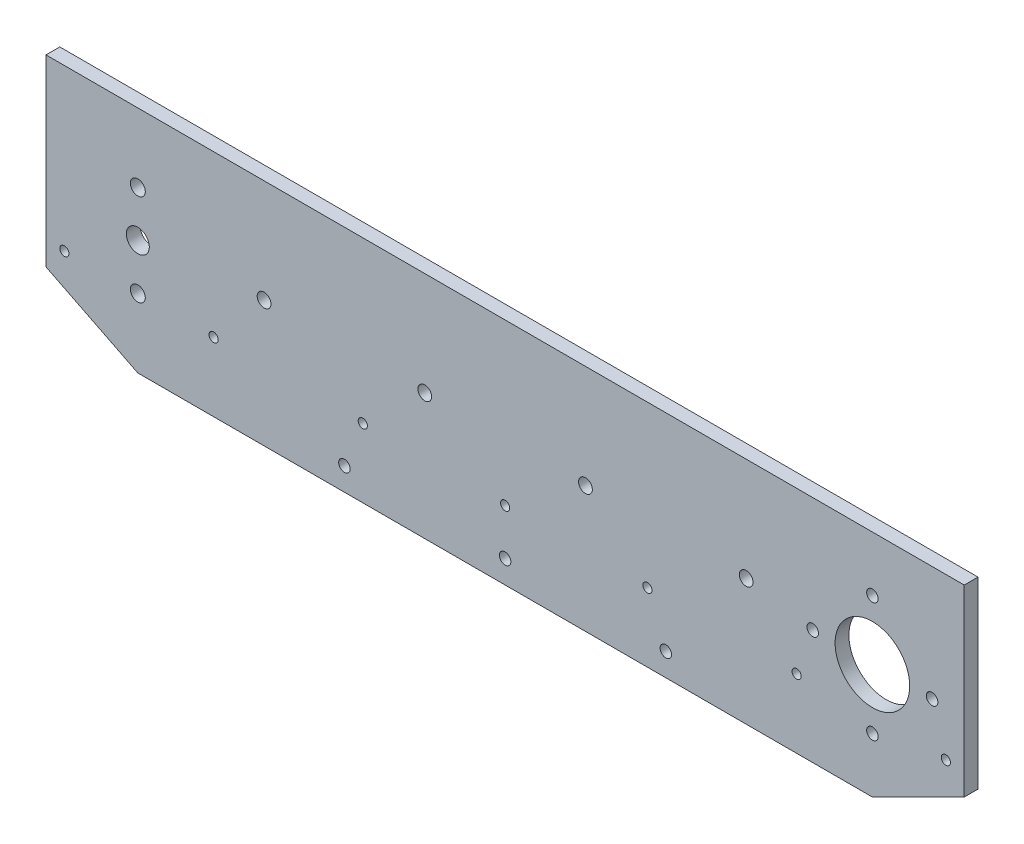
ISO-10303-21;
HEADER;
FILE_DESCRIPTION(('STEP AP214'),'2;1');
FILE_NAME('part.step','',(''),(''),'','','');
FILE_SCHEMA(('AUTOMOTIVE_DESIGN { 1 0 10303 214 1 1 1 1 }'));
ENDSEC;
DATA;
#1=APPLICATION_CONTEXT('core data for automotive mechanical design processes');
#2=APPLICATION_PROTOCOL_DEFINITION('international standard','automotive_design',2000,#1);
#3=PRODUCT_CONTEXT('',#1,'mechanical');
#4=PRODUCT('Part','Part','',(#3));
#5=PRODUCT_RELATED_PRODUCT_CATEGORY('part','',(#4));
#6=PRODUCT_DEFINITION_FORMATION('','',#4);
#7=PRODUCT_DEFINITION_CONTEXT('part definition',#1,'design');
#8=PRODUCT_DEFINITION('design','',#6,#7);
#9=PRODUCT_DEFINITION_SHAPE('','',#8);
#10=(LENGTH_UNIT() NAMED_UNIT(*) SI_UNIT(.MILLI.,.METRE.));
#11=(NAMED_UNIT(*) PLANE_ANGLE_UNIT() SI_UNIT($,.RADIAN.));
#12=(NAMED_UNIT(*) SI_UNIT($,.STERADIAN.) SOLID_ANGLE_UNIT());
#13=UNCERTAINTY_MEASURE_WITH_UNIT(LENGTH_MEASURE(1.E-05),#10,'distance_accuracy_value','');
#14=(GEOMETRIC_REPRESENTATION_CONTEXT(3) GLOBAL_UNCERTAINTY_ASSIGNED_CONTEXT((#13)) GLOBAL_UNIT_ASSIGNED_CONTEXT((#10,
#11,#12)) REPRESENTATION_CONTEXT('',''));
#15=CARTESIAN_POINT('',(0.,0.,0.));
#16=DIRECTION('',(0.,0.,1.));
#17=DIRECTION('',(1.,0.,0.));
#18=AXIS2_PLACEMENT_3D('',#15,#16,#17);
#19=CARTESIAN_POINT('',(200.,50.,6.));
#20=DIRECTION('',(-1.,0.,0.));
#21=DIRECTION('',(0.,0.,1.));
#22=AXIS2_PLACEMENT_3D('',#19,#20,#21);
#23=PLANE('',#22);
#24=DIRECTION('',(0.,1.,0.));
#25=VECTOR('',#24,1.);
#26=CARTESIAN_POINT('',(200.,50.,6.));
#27=LINE('',#26,#25);
#28=CARTESIAN_POINT('',(200.,-30.,6.));
#29=VERTEX_POINT('',#28);
#30=CARTESIAN_POINT('',(200.,50.,6.));
#31=VERTEX_POINT('',#30);
#32=EDGE_CURVE('E96',#29,#31,#27,.T.);
#33=ORIENTED_EDGE('',*,*,#32,.F.);
#34=DIRECTION('',(0.,0.,1.));
#35=VECTOR('',#34,1.);
#36=CARTESIAN_POINT('',(200.,-30.,0.));
#37=LINE('',#36,#35);
#38=CARTESIAN_POINT('',(200.,-30.,0.));
#39=VERTEX_POINT('',#38);
#40=EDGE_CURVE('E83',#39,#29,#37,.T.);
#41=ORIENTED_EDGE('',*,*,#40,.F.);
#42=DIRECTION('',(0.,1.,0.));
#43=VECTOR('',#42,1.);
#44=CARTESIAN_POINT('',(200.,50.,0.));
#45=LINE('',#44,#43);
#46=CARTESIAN_POINT('',(200.,50.,0.));
#47=VERTEX_POINT('',#46);
#48=EDGE_CURVE('E94',#39,#47,#45,.T.);
#49=ORIENTED_EDGE('',*,*,#48,.T.);
#50=DIRECTION('',(0.,0.,-1.));
#51=VECTOR('',#50,1.);
#52=CARTESIAN_POINT('',(200.,50.,6.));
#53=LINE('',#52,#51);
#54=EDGE_CURVE('E11',#31,#47,#53,.T.);
#55=ORIENTED_EDGE('',*,*,#54,.F.);
#56=EDGE_LOOP('',(#33,#41,#49,#55));
#57=FACE_BOUND('',#56,.T.);
#58=ADVANCED_FACE('F31',(#57),#23,.F.);
#59=CARTESIAN_POINT('',(-200.,50.,6.));
#60=DIRECTION('',(0.,-1.,0.));
#61=DIRECTION('',(0.,0.,-1.));
#62=AXIS2_PLACEMENT_3D('',#59,#60,#61);
#63=PLANE('',#62);
#64=DIRECTION('',(-1.,0.,0.));
#65=VECTOR('',#64,1.);
#66=CARTESIAN_POINT('',(-200.,50.,0.));
#67=LINE('',#66,#65);
#68=CARTESIAN_POINT('',(-200.,50.,0.));
#69=VERTEX_POINT('',#68);
#70=EDGE_CURVE('E100',#47,#69,#67,.T.);
#71=ORIENTED_EDGE('',*,*,#70,.T.);
#72=DIRECTION('',(0.,0.,-1.));
#73=VECTOR('',#72,1.);
#74=CARTESIAN_POINT('',(-200.,50.,6.));
#75=LINE('',#74,#73);
#76=CARTESIAN_POINT('',(-200.,50.,6.));
#77=VERTEX_POINT('',#76);
#78=EDGE_CURVE('E38',#77,#69,#75,.T.);
#79=ORIENTED_EDGE('',*,*,#78,.F.);
#80=DIRECTION('',(-1.,0.,0.));
#81=VECTOR('',#80,1.);
#82=CARTESIAN_POINT('',(-200.,50.,6.));
#83=LINE('',#82,#81);
#84=EDGE_CURVE('E123',#31,#77,#83,.T.);
#85=ORIENTED_EDGE('',*,*,#84,.F.);
#86=ORIENTED_EDGE('',*,*,#54,.T.);
#87=EDGE_LOOP('',(#71,#79,#85,#86));
#88=FACE_BOUND('',#87,.T.);
#89=ADVANCED_FACE('F327',(#88),#63,.F.);
#90=CARTESIAN_POINT('',(-200.,50.,6.));
#91=DIRECTION('',(1.,0.,0.));
#92=DIRECTION('',(0.,0.,-1.));
#93=AXIS2_PLACEMENT_3D('',#90,#91,#92);
#94=PLANE('',#93);
#95=DIRECTION('',(0.,-1.,0.));
#96=VECTOR('',#95,1.);
#97=CARTESIAN_POINT('',(-200.,50.,0.));
#98=LINE('',#97,#96);
#99=CARTESIAN_POINT('',(-200.,-30.,0.));
#100=VERTEX_POINT('',#99);
#101=EDGE_CURVE('E102',#69,#100,#98,.T.);
#102=ORIENTED_EDGE('',*,*,#101,.T.);
#103=DIRECTION('',(0.,0.,1.));
#104=VECTOR('',#103,1.);
#105=CARTESIAN_POINT('',(-200.,-30.,0.));
#106=LINE('',#105,#104);
#107=CARTESIAN_POINT('',(-200.,-30.,6.));
#108=VERTEX_POINT('',#107);
#109=EDGE_CURVE('E53',#100,#108,#106,.T.);
#110=ORIENTED_EDGE('',*,*,#109,.T.);
#111=DIRECTION('',(0.,-1.,0.));
#112=VECTOR('',#111,1.);
#113=CARTESIAN_POINT('',(-200.,50.,6.));
#114=LINE('',#113,#112);
#115=EDGE_CURVE('E118',#77,#108,#114,.T.);
#116=ORIENTED_EDGE('',*,*,#115,.F.);
#117=ORIENTED_EDGE('',*,*,#78,.T.);
#118=EDGE_LOOP('',(#102,#110,#116,#117));
#119=FACE_BOUND('',#118,.T.);
#120=ADVANCED_FACE('F325',(#119),#94,.F.);
#121=CARTESIAN_POINT('',(-200.,-50.,6.));
#122=DIRECTION('',(0.,1.,0.));
#123=DIRECTION('',(0.,0.,1.));
#124=AXIS2_PLACEMENT_3D('',#121,#122,#123);
#125=PLANE('',#124);
#126=DIRECTION('',(1.,0.,0.));
#127=VECTOR('',#126,1.);
#128=CARTESIAN_POINT('',(-200.,-50.,0.));
#129=LINE('',#128,#127);
#130=CARTESIAN_POINT('',(-160.,-50.,0.));
#131=VERTEX_POINT('',#130);
#132=CARTESIAN_POINT('',(160.,-50.,0.));
#133=VERTEX_POINT('',#132);
#134=EDGE_CURVE('E112',#131,#133,#129,.T.);
#135=ORIENTED_EDGE('',*,*,#134,.T.);
#136=DIRECTION('',(0.,0.,1.));
#137=VECTOR('',#136,1.);
#138=CARTESIAN_POINT('',(160.,-50.,0.));
#139=LINE('',#138,#137);
#140=CARTESIAN_POINT('',(160.,-50.,6.));
#141=VERTEX_POINT('',#140);
#142=EDGE_CURVE('E45',#133,#141,#139,.T.);
#143=ORIENTED_EDGE('',*,*,#142,.T.);
#144=DIRECTION('',(1.,0.,0.));
#145=VECTOR('',#144,1.);
#146=CARTESIAN_POINT('',(-200.,-50.,6.));
#147=LINE('',#146,#145);
#148=CARTESIAN_POINT('',(-160.,-50.,6.));
#149=VERTEX_POINT('',#148);
#150=EDGE_CURVE('E107',#149,#141,#147,.T.);
#151=ORIENTED_EDGE('',*,*,#150,.F.);
#152=DIRECTION('',(0.,0.,1.));
#153=VECTOR('',#152,1.);
#154=CARTESIAN_POINT('',(-160.,-50.,0.));
#155=LINE('',#154,#153);
#156=EDGE_CURVE('E104',#131,#149,#155,.T.);
#157=ORIENTED_EDGE('',*,*,#156,.F.);
#158=EDGE_LOOP('',(#135,#143,#151,#157));
#159=FACE_BOUND('',#158,.T.);
#160=ADVANCED_FACE('F279',(#159),#125,.F.);
#161=CARTESIAN_POINT('',(200.,-50.,6.));
#162=DIRECTION('',(0.,0.,1.));
#163=DIRECTION('',(1.,0.,0.));
#164=AXIS2_PLACEMENT_3D('',#161,#162,#163);
#165=PLANE('',#164);
#166=CARTESIAN_POINT('',(70.,-40.,6.));
#167=DIRECTION('',(0.,0.,1.));
#168=DIRECTION('',(1.,0.,0.));
#169=AXIS2_PLACEMENT_3D('',#166,#167,#168);
#170=CIRCLE('',#169,2.5);
#171=CARTESIAN_POINT('',(72.5,-40.,6.));
#172=VERTEX_POINT('',#171);
#173=EDGE_CURVE('E261',#172,#172,#170,.T.);
#174=ORIENTED_EDGE('',*,*,#173,.F.);
#175=EDGE_LOOP('',(#174));
#176=FACE_BOUND('',#175,.T.);
#177=CARTESIAN_POINT('',(0.,-40.,6.));
#178=DIRECTION('',(0.,0.,1.));
#179=DIRECTION('',(1.,0.,0.));
#180=AXIS2_PLACEMENT_3D('',#177,#178,#179);
#181=CIRCLE('',#180,2.5);
#182=CARTESIAN_POINT('',(2.5,-40.,6.));
#183=VERTEX_POINT('',#182);
#184=EDGE_CURVE('E255',#183,#183,#181,.T.);
#185=ORIENTED_EDGE('',*,*,#184,.F.);
#186=EDGE_LOOP('',(#185));
#187=FACE_BOUND('',#186,.T.);
#188=CARTESIAN_POINT('',(-70.,-40.,6.));
#189=DIRECTION('',(0.,0.,1.));
#190=DIRECTION('',(1.,0.,0.));
#191=AXIS2_PLACEMENT_3D('',#188,#189,#190);
#192=CIRCLE('',#191,2.5);
#193=CARTESIAN_POINT('',(-67.5,-40.,6.));
#194=VERTEX_POINT('',#193);
#195=EDGE_CURVE('E249',#194,#194,#192,.T.);
#196=ORIENTED_EDGE('',*,*,#195,.F.);
#197=EDGE_LOOP('',(#196));
#198=FACE_BOUND('',#197,.T.);
#199=CARTESIAN_POINT('',(192.,-20.,6.));
#200=DIRECTION('',(0.,0.,1.));
#201=DIRECTION('',(1.,0.,0.));
#202=AXIS2_PLACEMENT_3D('',#199,#200,#201);
#203=CIRCLE('',#202,2.);
#204=CARTESIAN_POINT('',(194.,-20.,6.));
#205=VERTEX_POINT('',#204);
#206=EDGE_CURVE('E243',#205,#205,#203,.T.);
#207=ORIENTED_EDGE('',*,*,#206,.F.);
#208=EDGE_LOOP('',(#207));
#209=FACE_BOUND('',#208,.T.);
#210=CARTESIAN_POINT('',(-127.,-20.,6.));
#211=DIRECTION('',(0.,0.,1.));
#212=DIRECTION('',(1.,0.,0.));
#213=AXIS2_PLACEMENT_3D('',#210,#211,#212);
#214=CIRCLE('',#213,2.);
#215=CARTESIAN_POINT('',(-125.,-20.,6.));
#216=VERTEX_POINT('',#215);
#217=EDGE_CURVE('E237',#216,#216,#214,.T.);
#218=ORIENTED_EDGE('',*,*,#217,.F.);
#219=EDGE_LOOP('',(#218));
#220=FACE_BOUND('',#219,.T.);
#221=CARTESIAN_POINT('',(127.,-20.,6.));
#222=DIRECTION('',(0.,0.,1.));
#223=DIRECTION('',(1.,0.,0.));
#224=AXIS2_PLACEMENT_3D('',#221,#222,#223);
#225=CIRCLE('',#224,1.99999999999999);
#226=CARTESIAN_POINT('',(129.,-20.,6.));
#227=VERTEX_POINT('',#226);
#228=EDGE_CURVE('E231',#227,#227,#225,.T.);
#229=ORIENTED_EDGE('',*,*,#228,.F.);
#230=EDGE_LOOP('',(#229));
#231=FACE_BOUND('',#230,.T.);
#232=CARTESIAN_POINT('',(-192.,-20.0000000000001,6.));
#233=DIRECTION('',(0.,0.,1.));
#234=DIRECTION('',(1.,0.,0.));
#235=AXIS2_PLACEMENT_3D('',#232,#233,#234);
#236=CIRCLE('',#235,2.);
#237=CARTESIAN_POINT('',(-190.,-20.0000000000001,6.));
#238=VERTEX_POINT('',#237);
#239=EDGE_CURVE('E225',#238,#238,#236,.T.);
#240=ORIENTED_EDGE('',*,*,#239,.F.);
#241=EDGE_LOOP('',(#240));
#242=FACE_BOUND('',#241,.T.);
#243=CARTESIAN_POINT('',(62.0000000000001,-20.,6.));
#244=DIRECTION('',(0.,0.,1.));
#245=DIRECTION('',(1.,0.,0.));
#246=AXIS2_PLACEMENT_3D('',#243,#244,#245);
#247=CIRCLE('',#246,2.);
#248=CARTESIAN_POINT('',(64.0000000000001,-20.,6.));
#249=VERTEX_POINT('',#248);
#250=EDGE_CURVE('E219',#249,#249,#247,.T.);
#251=ORIENTED_EDGE('',*,*,#250,.F.);
#252=EDGE_LOOP('',(#251));
#253=FACE_BOUND('',#252,.T.);
#254=CARTESIAN_POINT('',(0.,-20.,6.));
#255=DIRECTION('',(0.,0.,1.));
#256=DIRECTION('',(1.,0.,0.));
#257=AXIS2_PLACEMENT_3D('',#254,#255,#256);
#258=CIRCLE('',#257,2.);
#259=CARTESIAN_POINT('',(2.00000000000008,-20.,6.));
#260=VERTEX_POINT('',#259);
#261=EDGE_CURVE('E213',#260,#260,#258,.T.);
#262=ORIENTED_EDGE('',*,*,#261,.F.);
#263=EDGE_LOOP('',(#262));
#264=FACE_BOUND('',#263,.T.);
#265=CARTESIAN_POINT('',(-61.9999999999999,-20.,6.));
#266=DIRECTION('',(0.,0.,1.));
#267=DIRECTION('',(1.,0.,0.));
#268=AXIS2_PLACEMENT_3D('',#265,#266,#267);
#269=CIRCLE('',#268,2.);
#270=CARTESIAN_POINT('',(-59.9999999999999,-20.,6.));
#271=VERTEX_POINT('',#270);
#272=EDGE_CURVE('E207',#271,#271,#269,.T.);
#273=ORIENTED_EDGE('',*,*,#272,.F.);
#274=EDGE_LOOP('',(#273));
#275=FACE_BOUND('',#274,.T.);
#276=CARTESIAN_POINT('',(105.,5.,6.));
#277=DIRECTION('',(0.,0.,1.));
#278=DIRECTION('',(1.,0.,0.));
#279=AXIS2_PLACEMENT_3D('',#276,#277,#278);
#280=CIRCLE('',#279,3.00000000000001);
#281=CARTESIAN_POINT('',(108.,5.,6.));
#282=VERTEX_POINT('',#281);
#283=EDGE_CURVE('E201',#282,#282,#280,.T.);
#284=ORIENTED_EDGE('',*,*,#283,.F.);
#285=EDGE_LOOP('',(#284));
#286=FACE_BOUND('',#285,.T.);
#287=CARTESIAN_POINT('',(35.,5.,6.));
#288=DIRECTION('',(0.,0.,1.));
#289=DIRECTION('',(1.,0.,0.));
#290=AXIS2_PLACEMENT_3D('',#287,#288,#289);
#291=CIRCLE('',#290,3.);
#292=CARTESIAN_POINT('',(38.,5.,6.));
#293=VERTEX_POINT('',#292);
#294=EDGE_CURVE('E195',#293,#293,#291,.T.);
#295=ORIENTED_EDGE('',*,*,#294,.F.);
#296=EDGE_LOOP('',(#295));
#297=FACE_BOUND('',#296,.T.);
#298=CARTESIAN_POINT('',(-35.,5.,6.));
#299=DIRECTION('',(0.,0.,1.));
#300=DIRECTION('',(1.,0.,0.));
#301=AXIS2_PLACEMENT_3D('',#298,#299,#300);
#302=CIRCLE('',#301,3.00000000000001);
#303=CARTESIAN_POINT('',(-32.,5.,6.));
#304=VERTEX_POINT('',#303);
#305=EDGE_CURVE('E189',#304,#304,#302,.T.);
#306=ORIENTED_EDGE('',*,*,#305,.F.);
#307=EDGE_LOOP('',(#306));
#308=FACE_BOUND('',#307,.T.);
#309=CARTESIAN_POINT('',(-105.,5.,6.));
#310=DIRECTION('',(0.,0.,1.));
#311=DIRECTION('',(1.,0.,0.));
#312=AXIS2_PLACEMENT_3D('',#309,#310,#311);
#313=CIRCLE('',#312,2.99999999999999);
#314=CARTESIAN_POINT('',(-102.,5.,6.));
#315=VERTEX_POINT('',#314);
#316=EDGE_CURVE('E183',#315,#315,#313,.T.);
#317=ORIENTED_EDGE('',*,*,#316,.F.);
#318=EDGE_LOOP('',(#317));
#319=FACE_BOUND('',#318,.T.);
#320=CARTESIAN_POINT('',(160.,-26.,6.));
#321=DIRECTION('',(0.,0.,1.));
#322=DIRECTION('',(1.,0.,0.));
#323=AXIS2_PLACEMENT_3D('',#320,#321,#322);
#324=CIRCLE('',#323,2.5);
#325=CARTESIAN_POINT('',(162.5,-26.,6.));
#326=VERTEX_POINT('',#325);
#327=EDGE_CURVE('E177',#326,#326,#324,.T.);
#328=ORIENTED_EDGE('',*,*,#327,.F.);
#329=EDGE_LOOP('',(#328));
#330=FACE_BOUND('',#329,.T.);
#331=CARTESIAN_POINT('',(186.,0.,6.));
#332=DIRECTION('',(0.,0.,1.));
#333=DIRECTION('',(1.,0.,0.));
#334=AXIS2_PLACEMENT_3D('',#331,#332,#333);
#335=CIRCLE('',#334,2.5);
#336=CARTESIAN_POINT('',(188.5,0.,6.));
#337=VERTEX_POINT('',#336);
#338=EDGE_CURVE('E171',#337,#337,#335,.T.);
#339=ORIENTED_EDGE('',*,*,#338,.F.);
#340=EDGE_LOOP('',(#339));
#341=FACE_BOUND('',#340,.T.);
#342=CARTESIAN_POINT('',(134.,0.,6.));
#343=DIRECTION('',(0.,0.,1.));
#344=DIRECTION('',(1.,0.,0.));
#345=AXIS2_PLACEMENT_3D('',#342,#343,#344);
#346=CIRCLE('',#345,2.5);
#347=CARTESIAN_POINT('',(136.5,0.,6.));
#348=VERTEX_POINT('',#347);
#349=EDGE_CURVE('E165',#348,#348,#346,.T.);
#350=ORIENTED_EDGE('',*,*,#349,.F.);
#351=EDGE_LOOP('',(#350));
#352=FACE_BOUND('',#351,.T.);
#353=CARTESIAN_POINT('',(160.,26.,6.));
#354=DIRECTION('',(0.,0.,1.));
#355=DIRECTION('',(1.,0.,0.));
#356=AXIS2_PLACEMENT_3D('',#353,#354,#355);
#357=CIRCLE('',#356,2.5);
#358=CARTESIAN_POINT('',(162.5,26.,6.));
#359=VERTEX_POINT('',#358);
#360=EDGE_CURVE('E159',#359,#359,#357,.T.);
#361=ORIENTED_EDGE('',*,*,#360,.F.);
#362=EDGE_LOOP('',(#361));
#363=FACE_BOUND('',#362,.T.);
#364=CARTESIAN_POINT('',(160.,0.,6.));
#365=DIRECTION('',(0.,0.,1.));
#366=DIRECTION('',(1.,0.,0.));
#367=AXIS2_PLACEMENT_3D('',#364,#365,#366);
#368=CIRCLE('',#367,16.25);
#369=CARTESIAN_POINT('',(176.25,0.,6.));
#370=VERTEX_POINT('',#369);
#371=EDGE_CURVE('E153',#370,#370,#368,.T.);
#372=ORIENTED_EDGE('',*,*,#371,.F.);
#373=EDGE_LOOP('',(#372));
#374=FACE_BOUND('',#373,.T.);
#375=CARTESIAN_POINT('',(-160.,-20.,6.));
#376=DIRECTION('',(0.,0.,1.));
#377=DIRECTION('',(1.,0.,0.));
#378=AXIS2_PLACEMENT_3D('',#375,#376,#377);
#379=CIRCLE('',#378,3.25000000000001);
#380=CARTESIAN_POINT('',(-156.75,-20.,6.));
#381=VERTEX_POINT('',#380);
#382=EDGE_CURVE('E147',#381,#381,#379,.T.);
#383=ORIENTED_EDGE('',*,*,#382,.F.);
#384=EDGE_LOOP('',(#383));
#385=FACE_BOUND('',#384,.T.);
#386=CARTESIAN_POINT('',(-160.,20.,6.));
#387=DIRECTION('',(0.,0.,1.));
#388=DIRECTION('',(1.,0.,0.));
#389=AXIS2_PLACEMENT_3D('',#386,#387,#388);
#390=CIRCLE('',#389,3.25000000000001);
#391=CARTESIAN_POINT('',(-156.75,20.,6.));
#392=VERTEX_POINT('',#391);
#393=EDGE_CURVE('E141',#392,#392,#390,.T.);
#394=ORIENTED_EDGE('',*,*,#393,.F.);
#395=EDGE_LOOP('',(#394));
#396=FACE_BOUND('',#395,.T.);
#397=CARTESIAN_POINT('',(-160.,0.,6.));
#398=DIRECTION('',(0.,0.,1.));
#399=DIRECTION('',(1.,0.,0.));
#400=AXIS2_PLACEMENT_3D('',#397,#398,#399);
#401=CIRCLE('',#400,4.99999999999999);
#402=CARTESIAN_POINT('',(-155.,0.,6.));
#403=VERTEX_POINT('',#402);
#404=EDGE_CURVE('E135',#403,#403,#401,.T.);
#405=ORIENTED_EDGE('',*,*,#404,.F.);
#406=EDGE_LOOP('',(#405));
#407=FACE_BOUND('',#406,.T.);
#408=DIRECTION('',(-0.894427190999916,-0.447213595499958,0.));
#409=VECTOR('',#408,1.);
#410=CARTESIAN_POINT('',(200.,-30.,6.));
#411=LINE('',#410,#409);
#412=EDGE_CURVE('E89',#29,#141,#411,.T.);
#413=ORIENTED_EDGE('',*,*,#412,.F.);
#414=ORIENTED_EDGE('',*,*,#32,.T.);
#415=ORIENTED_EDGE('',*,*,#84,.T.);
#416=ORIENTED_EDGE('',*,*,#115,.T.);
#417=DIRECTION('',(-0.894427190999916,0.447213595499958,0.));
#418=VECTOR('',#417,1.);
#419=CARTESIAN_POINT('',(-200.,-30.,6.));
#420=LINE('',#419,#418);
#421=EDGE_CURVE('E129',#149,#108,#420,.T.);
#422=ORIENTED_EDGE('',*,*,#421,.F.);
#423=ORIENTED_EDGE('',*,*,#150,.T.);
#424=EDGE_LOOP('',(#413,#414,#415,#416,#422,#423));
#425=FACE_BOUND('',#424,.T.);
#426=ADVANCED_FACE('F276',(#176,#187,#198,#209,#220,#231,#242,#253,#264,#275,#286,#297,#308,
#319,#330,#341,#352,#363,#374,#385,#396,#407,#425),#165,.T.);
#427=CARTESIAN_POINT('',(200.,-50.,0.));
#428=DIRECTION('',(0.,0.,1.));
#429=DIRECTION('',(1.,0.,0.));
#430=AXIS2_PLACEMENT_3D('',#427,#428,#429);
#431=PLANE('',#430);
#432=CARTESIAN_POINT('',(70.,-40.,0.));
#433=DIRECTION('',(0.,0.,1.));
#434=DIRECTION('',(1.,0.,0.));
#435=AXIS2_PLACEMENT_3D('',#432,#433,#434);
#436=CIRCLE('',#435,2.5);
#437=CARTESIAN_POINT('',(72.5,-40.,0.));
#438=VERTEX_POINT('',#437);
#439=EDGE_CURVE('E258',#438,#438,#436,.T.);
#440=ORIENTED_EDGE('',*,*,#439,.T.);
#441=EDGE_LOOP('',(#440));
#442=FACE_BOUND('',#441,.T.);
#443=CARTESIAN_POINT('',(0.,-40.,0.));
#444=DIRECTION('',(0.,0.,1.));
#445=DIRECTION('',(1.,0.,0.));
#446=AXIS2_PLACEMENT_3D('',#443,#444,#445);
#447=CIRCLE('',#446,2.5);
#448=CARTESIAN_POINT('',(2.5,-40.,0.));
#449=VERTEX_POINT('',#448);
#450=EDGE_CURVE('E252',#449,#449,#447,.T.);
#451=ORIENTED_EDGE('',*,*,#450,.T.);
#452=EDGE_LOOP('',(#451));
#453=FACE_BOUND('',#452,.T.);
#454=CARTESIAN_POINT('',(-70.,-40.,0.));
#455=DIRECTION('',(0.,0.,1.));
#456=DIRECTION('',(1.,0.,0.));
#457=AXIS2_PLACEMENT_3D('',#454,#455,#456);
#458=CIRCLE('',#457,2.5);
#459=CARTESIAN_POINT('',(-67.5,-40.,0.));
#460=VERTEX_POINT('',#459);
#461=EDGE_CURVE('E246',#460,#460,#458,.T.);
#462=ORIENTED_EDGE('',*,*,#461,.T.);
#463=EDGE_LOOP('',(#462));
#464=FACE_BOUND('',#463,.T.);
#465=CARTESIAN_POINT('',(192.,-20.,0.));
#466=DIRECTION('',(0.,0.,1.));
#467=DIRECTION('',(1.,0.,0.));
#468=AXIS2_PLACEMENT_3D('',#465,#466,#467);
#469=CIRCLE('',#468,2.);
#470=CARTESIAN_POINT('',(194.,-20.,0.));
#471=VERTEX_POINT('',#470);
#472=EDGE_CURVE('E240',#471,#471,#469,.T.);
#473=ORIENTED_EDGE('',*,*,#472,.T.);
#474=EDGE_LOOP('',(#473));
#475=FACE_BOUND('',#474,.T.);
#476=CARTESIAN_POINT('',(-127.,-20.,0.));
#477=DIRECTION('',(0.,0.,1.));
#478=DIRECTION('',(1.,0.,0.));
#479=AXIS2_PLACEMENT_3D('',#476,#477,#478);
#480=CIRCLE('',#479,2.);
#481=CARTESIAN_POINT('',(-125.,-20.,0.));
#482=VERTEX_POINT('',#481);
#483=EDGE_CURVE('E234',#482,#482,#480,.T.);
#484=ORIENTED_EDGE('',*,*,#483,.T.);
#485=EDGE_LOOP('',(#484));
#486=FACE_BOUND('',#485,.T.);
#487=CARTESIAN_POINT('',(127.,-20.,0.));
#488=DIRECTION('',(0.,0.,1.));
#489=DIRECTION('',(1.,0.,0.));
#490=AXIS2_PLACEMENT_3D('',#487,#488,#489);
#491=CIRCLE('',#490,1.99999999999999);
#492=CARTESIAN_POINT('',(129.,-20.,0.));
#493=VERTEX_POINT('',#492);
#494=EDGE_CURVE('E228',#493,#493,#491,.T.);
#495=ORIENTED_EDGE('',*,*,#494,.T.);
#496=EDGE_LOOP('',(#495));
#497=FACE_BOUND('',#496,.T.);
#498=CARTESIAN_POINT('',(-192.,-20.0000000000001,0.));
#499=DIRECTION('',(0.,0.,1.));
#500=DIRECTION('',(1.,0.,0.));
#501=AXIS2_PLACEMENT_3D('',#498,#499,#500);
#502=CIRCLE('',#501,2.);
#503=CARTESIAN_POINT('',(-190.,-20.0000000000001,0.));
#504=VERTEX_POINT('',#503);
#505=EDGE_CURVE('E222',#504,#504,#502,.T.);
#506=ORIENTED_EDGE('',*,*,#505,.T.);
#507=EDGE_LOOP('',(#506));
#508=FACE_BOUND('',#507,.T.);
#509=CARTESIAN_POINT('',(62.0000000000001,-20.,0.));
#510=DIRECTION('',(0.,0.,1.));
#511=DIRECTION('',(1.,0.,0.));
#512=AXIS2_PLACEMENT_3D('',#509,#510,#511);
#513=CIRCLE('',#512,2.);
#514=CARTESIAN_POINT('',(64.0000000000001,-20.,0.));
#515=VERTEX_POINT('',#514);
#516=EDGE_CURVE('E216',#515,#515,#513,.T.);
#517=ORIENTED_EDGE('',*,*,#516,.T.);
#518=EDGE_LOOP('',(#517));
#519=FACE_BOUND('',#518,.T.);
#520=CARTESIAN_POINT('',(0.,-20.,0.));
#521=DIRECTION('',(0.,0.,1.));
#522=DIRECTION('',(1.,0.,0.));
#523=AXIS2_PLACEMENT_3D('',#520,#521,#522);
#524=CIRCLE('',#523,2.);
#525=CARTESIAN_POINT('',(2.00000000000008,-20.,0.));
#526=VERTEX_POINT('',#525);
#527=EDGE_CURVE('E210',#526,#526,#524,.T.);
#528=ORIENTED_EDGE('',*,*,#527,.T.);
#529=EDGE_LOOP('',(#528));
#530=FACE_BOUND('',#529,.T.);
#531=CARTESIAN_POINT('',(-61.9999999999999,-20.,0.));
#532=DIRECTION('',(0.,0.,1.));
#533=DIRECTION('',(1.,0.,0.));
#534=AXIS2_PLACEMENT_3D('',#531,#532,#533);
#535=CIRCLE('',#534,2.);
#536=CARTESIAN_POINT('',(-59.9999999999999,-20.,0.));
#537=VERTEX_POINT('',#536);
#538=EDGE_CURVE('E204',#537,#537,#535,.T.);
#539=ORIENTED_EDGE('',*,*,#538,.T.);
#540=EDGE_LOOP('',(#539));
#541=FACE_BOUND('',#540,.T.);
#542=CARTESIAN_POINT('',(105.,5.,0.));
#543=DIRECTION('',(0.,0.,1.));
#544=DIRECTION('',(1.,0.,0.));
#545=AXIS2_PLACEMENT_3D('',#542,#543,#544);
#546=CIRCLE('',#545,3.00000000000001);
#547=CARTESIAN_POINT('',(108.,5.,0.));
#548=VERTEX_POINT('',#547);
#549=EDGE_CURVE('E198',#548,#548,#546,.T.);
#550=ORIENTED_EDGE('',*,*,#549,.T.);
#551=EDGE_LOOP('',(#550));
#552=FACE_BOUND('',#551,.T.);
#553=CARTESIAN_POINT('',(35.,5.,0.));
#554=DIRECTION('',(0.,0.,1.));
#555=DIRECTION('',(1.,0.,0.));
#556=AXIS2_PLACEMENT_3D('',#553,#554,#555);
#557=CIRCLE('',#556,3.);
#558=CARTESIAN_POINT('',(38.,5.,0.));
#559=VERTEX_POINT('',#558);
#560=EDGE_CURVE('E192',#559,#559,#557,.T.);
#561=ORIENTED_EDGE('',*,*,#560,.T.);
#562=EDGE_LOOP('',(#561));
#563=FACE_BOUND('',#562,.T.);
#564=CARTESIAN_POINT('',(-35.,5.,0.));
#565=DIRECTION('',(0.,0.,1.));
#566=DIRECTION('',(1.,0.,0.));
#567=AXIS2_PLACEMENT_3D('',#564,#565,#566);
#568=CIRCLE('',#567,3.00000000000001);
#569=CARTESIAN_POINT('',(-32.,5.,0.));
#570=VERTEX_POINT('',#569);
#571=EDGE_CURVE('E186',#570,#570,#568,.T.);
#572=ORIENTED_EDGE('',*,*,#571,.T.);
#573=EDGE_LOOP('',(#572));
#574=FACE_BOUND('',#573,.T.);
#575=CARTESIAN_POINT('',(-105.,5.,0.));
#576=DIRECTION('',(0.,0.,1.));
#577=DIRECTION('',(1.,0.,0.));
#578=AXIS2_PLACEMENT_3D('',#575,#576,#577);
#579=CIRCLE('',#578,2.99999999999999);
#580=CARTESIAN_POINT('',(-102.,5.,0.));
#581=VERTEX_POINT('',#580);
#582=EDGE_CURVE('E180',#581,#581,#579,.T.);
#583=ORIENTED_EDGE('',*,*,#582,.T.);
#584=EDGE_LOOP('',(#583));
#585=FACE_BOUND('',#584,.T.);
#586=CARTESIAN_POINT('',(160.,-26.,0.));
#587=DIRECTION('',(0.,0.,1.));
#588=DIRECTION('',(1.,0.,0.));
#589=AXIS2_PLACEMENT_3D('',#586,#587,#588);
#590=CIRCLE('',#589,2.5);
#591=CARTESIAN_POINT('',(162.5,-26.,0.));
#592=VERTEX_POINT('',#591);
#593=EDGE_CURVE('E174',#592,#592,#590,.T.);
#594=ORIENTED_EDGE('',*,*,#593,.T.);
#595=EDGE_LOOP('',(#594));
#596=FACE_BOUND('',#595,.T.);
#597=CARTESIAN_POINT('',(186.,0.,0.));
#598=DIRECTION('',(0.,0.,1.));
#599=DIRECTION('',(1.,0.,0.));
#600=AXIS2_PLACEMENT_3D('',#597,#598,#599);
#601=CIRCLE('',#600,2.5);
#602=CARTESIAN_POINT('',(188.5,0.,0.));
#603=VERTEX_POINT('',#602);
#604=EDGE_CURVE('E168',#603,#603,#601,.T.);
#605=ORIENTED_EDGE('',*,*,#604,.T.);
#606=EDGE_LOOP('',(#605));
#607=FACE_BOUND('',#606,.T.);
#608=CARTESIAN_POINT('',(134.,0.,0.));
#609=DIRECTION('',(0.,0.,1.));
#610=DIRECTION('',(1.,0.,0.));
#611=AXIS2_PLACEMENT_3D('',#608,#609,#610);
#612=CIRCLE('',#611,2.5);
#613=CARTESIAN_POINT('',(136.5,0.,0.));
#614=VERTEX_POINT('',#613);
#615=EDGE_CURVE('E162',#614,#614,#612,.T.);
#616=ORIENTED_EDGE('',*,*,#615,.T.);
#617=EDGE_LOOP('',(#616));
#618=FACE_BOUND('',#617,.T.);
#619=CARTESIAN_POINT('',(160.,26.,0.));
#620=DIRECTION('',(0.,0.,1.));
#621=DIRECTION('',(1.,0.,0.));
#622=AXIS2_PLACEMENT_3D('',#619,#620,#621);
#623=CIRCLE('',#622,2.5);
#624=CARTESIAN_POINT('',(162.5,26.,0.));
#625=VERTEX_POINT('',#624);
#626=EDGE_CURVE('E156',#625,#625,#623,.T.);
#627=ORIENTED_EDGE('',*,*,#626,.T.);
#628=EDGE_LOOP('',(#627));
#629=FACE_BOUND('',#628,.T.);
#630=CARTESIAN_POINT('',(160.,0.,0.));
#631=DIRECTION('',(0.,0.,1.));
#632=DIRECTION('',(1.,0.,0.));
#633=AXIS2_PLACEMENT_3D('',#630,#631,#632);
#634=CIRCLE('',#633,16.25);
#635=CARTESIAN_POINT('',(176.25,0.,0.));
#636=VERTEX_POINT('',#635);
#637=EDGE_CURVE('E150',#636,#636,#634,.T.);
#638=ORIENTED_EDGE('',*,*,#637,.T.);
#639=EDGE_LOOP('',(#638));
#640=FACE_BOUND('',#639,.T.);
#641=CARTESIAN_POINT('',(-160.,-20.,0.));
#642=DIRECTION('',(0.,0.,1.));
#643=DIRECTION('',(1.,0.,0.));
#644=AXIS2_PLACEMENT_3D('',#641,#642,#643);
#645=CIRCLE('',#644,3.25000000000001);
#646=CARTESIAN_POINT('',(-156.75,-20.,0.));
#647=VERTEX_POINT('',#646);
#648=EDGE_CURVE('E144',#647,#647,#645,.T.);
#649=ORIENTED_EDGE('',*,*,#648,.T.);
#650=EDGE_LOOP('',(#649));
#651=FACE_BOUND('',#650,.T.);
#652=CARTESIAN_POINT('',(-160.,20.,0.));
#653=DIRECTION('',(0.,0.,1.));
#654=DIRECTION('',(1.,0.,0.));
#655=AXIS2_PLACEMENT_3D('',#652,#653,#654);
#656=CIRCLE('',#655,3.25000000000001);
#657=CARTESIAN_POINT('',(-156.75,20.,0.));
#658=VERTEX_POINT('',#657);
#659=EDGE_CURVE('E138',#658,#658,#656,.T.);
#660=ORIENTED_EDGE('',*,*,#659,.T.);
#661=EDGE_LOOP('',(#660));
#662=FACE_BOUND('',#661,.T.);
#663=CARTESIAN_POINT('',(-160.,0.,0.));
#664=DIRECTION('',(0.,0.,1.));
#665=DIRECTION('',(1.,0.,0.));
#666=AXIS2_PLACEMENT_3D('',#663,#664,#665);
#667=CIRCLE('',#666,4.99999999999999);
#668=CARTESIAN_POINT('',(-155.,0.,0.));
#669=VERTEX_POINT('',#668);
#670=EDGE_CURVE('E133',#669,#669,#667,.T.);
#671=ORIENTED_EDGE('',*,*,#670,.T.);
#672=EDGE_LOOP('',(#671));
#673=FACE_BOUND('',#672,.T.);
#674=ORIENTED_EDGE('',*,*,#48,.F.);
#675=DIRECTION('',(-0.894427190999916,-0.447213595499958,0.));
#676=VECTOR('',#675,1.);
#677=CARTESIAN_POINT('',(200.,-30.,0.));
#678=LINE('',#677,#676);
#679=EDGE_CURVE('E80',#39,#133,#678,.T.);
#680=ORIENTED_EDGE('',*,*,#679,.T.);
#681=ORIENTED_EDGE('',*,*,#134,.F.);
#682=DIRECTION('',(-0.894427190999916,0.447213595499958,0.));
#683=VECTOR('',#682,1.);
#684=CARTESIAN_POINT('',(-200.,-30.,0.));
#685=LINE('',#684,#683);
#686=EDGE_CURVE('E127',#131,#100,#685,.T.);
#687=ORIENTED_EDGE('',*,*,#686,.T.);
#688=ORIENTED_EDGE('',*,*,#101,.F.);
#689=ORIENTED_EDGE('',*,*,#70,.F.);
#690=EDGE_LOOP('',(#674,#680,#681,#687,#688,#689));
#691=FACE_BOUND('',#690,.T.);
#692=ADVANCED_FACE('F98',(#442,#453,#464,#475,#486,#497,#508,#519,#530,#541,#552,#563,#574,#585,
#596,#607,#618,#629,#640,#651,#662,#673,#691),#431,.F.);
#693=CARTESIAN_POINT('',(-200.,-30.,0.));
#694=DIRECTION('',(0.447213595499958,0.894427190999916,0.));
#695=DIRECTION('',(-0.894427190999916,0.447213595499958,0.));
#696=AXIS2_PLACEMENT_3D('',#693,#694,#695);
#697=PLANE('',#696);
#698=ORIENTED_EDGE('',*,*,#421,.T.);
#699=ORIENTED_EDGE('',*,*,#109,.F.);
#700=ORIENTED_EDGE('',*,*,#686,.F.);
#701=ORIENTED_EDGE('',*,*,#156,.T.);
#702=EDGE_LOOP('',(#698,#699,#700,#701));
#703=FACE_BOUND('',#702,.T.);
#704=ADVANCED_FACE('F370',(#703),#697,.F.);
#705=CARTESIAN_POINT('',(200.,-30.,0.));
#706=DIRECTION('',(-0.447213595499958,0.894427190999916,0.));
#707=DIRECTION('',(-0.894427190999916,-0.447213595499958,0.));
#708=AXIS2_PLACEMENT_3D('',#705,#706,#707);
#709=PLANE('',#708);
#710=ORIENTED_EDGE('',*,*,#412,.T.);
#711=ORIENTED_EDGE('',*,*,#142,.F.);
#712=ORIENTED_EDGE('',*,*,#679,.F.);
#713=ORIENTED_EDGE('',*,*,#40,.T.);
#714=EDGE_LOOP('',(#710,#711,#712,#713));
#715=FACE_BOUND('',#714,.T.);
#716=ADVANCED_FACE('F82',(#715),#709,.F.);
#717=CARTESIAN_POINT('',(-160.,0.,0.));
#718=DIRECTION('',(0.,0.,1.));
#719=DIRECTION('',(1.,0.,0.));
#720=AXIS2_PLACEMENT_3D('',#717,#718,#719);
#721=CYLINDRICAL_SURFACE('',#720,4.99999999999999);
#722=ORIENTED_EDGE('',*,*,#670,.F.);
#723=EDGE_LOOP('',(#722));
#724=FACE_BOUND('',#723,.T.);
#725=ORIENTED_EDGE('',*,*,#404,.T.);
#726=EDGE_LOOP('',(#725));
#727=FACE_BOUND('',#726,.T.);
#728=ADVANCED_FACE('F385',(#724,#727),#721,.F.);
#729=CARTESIAN_POINT('',(-160.,20.,0.));
#730=DIRECTION('',(0.,0.,1.));
#731=DIRECTION('',(1.,0.,0.));
#732=AXIS2_PLACEMENT_3D('',#729,#730,#731);
#733=CYLINDRICAL_SURFACE('',#732,3.25000000000001);
#734=ORIENTED_EDGE('',*,*,#659,.F.);
#735=EDGE_LOOP('',(#734));
#736=FACE_BOUND('',#735,.T.);
#737=ORIENTED_EDGE('',*,*,#393,.T.);
#738=EDGE_LOOP('',(#737));
#739=FACE_BOUND('',#738,.T.);
#740=ADVANCED_FACE('F393',(#736,#739),#733,.F.);
#741=CARTESIAN_POINT('',(-160.,-20.,0.));
#742=DIRECTION('',(0.,0.,1.));
#743=DIRECTION('',(1.,0.,0.));
#744=AXIS2_PLACEMENT_3D('',#741,#742,#743);
#745=CYLINDRICAL_SURFACE('',#744,3.25000000000001);
#746=ORIENTED_EDGE('',*,*,#648,.F.);
#747=EDGE_LOOP('',(#746));
#748=FACE_BOUND('',#747,.T.);
#749=ORIENTED_EDGE('',*,*,#382,.T.);
#750=EDGE_LOOP('',(#749));
#751=FACE_BOUND('',#750,.T.);
#752=ADVANCED_FACE('F402',(#748,#751),#745,.F.);
#753=CARTESIAN_POINT('',(160.,0.,0.));
#754=DIRECTION('',(0.,0.,1.));
#755=DIRECTION('',(1.,0.,0.));
#756=AXIS2_PLACEMENT_3D('',#753,#754,#755);
#757=CYLINDRICAL_SURFACE('',#756,16.25);
#758=ORIENTED_EDGE('',*,*,#637,.F.);
#759=EDGE_LOOP('',(#758));
#760=FACE_BOUND('',#759,.T.);
#761=ORIENTED_EDGE('',*,*,#371,.T.);
#762=EDGE_LOOP('',(#761));
#763=FACE_BOUND('',#762,.T.);
#764=ADVANCED_FACE('F411',(#760,#763),#757,.F.);
#765=CARTESIAN_POINT('',(160.,26.,0.));
#766=DIRECTION('',(0.,0.,1.));
#767=DIRECTION('',(1.,0.,0.));
#768=AXIS2_PLACEMENT_3D('',#765,#766,#767);
#769=CYLINDRICAL_SURFACE('',#768,2.5);
#770=ORIENTED_EDGE('',*,*,#626,.F.);
#771=EDGE_LOOP('',(#770));
#772=FACE_BOUND('',#771,.T.);
#773=ORIENTED_EDGE('',*,*,#360,.T.);
#774=EDGE_LOOP('',(#773));
#775=FACE_BOUND('',#774,.T.);
#776=ADVANCED_FACE('F420',(#772,#775),#769,.F.);
#777=CARTESIAN_POINT('',(134.,0.,0.));
#778=DIRECTION('',(0.,0.,1.));
#779=DIRECTION('',(1.,0.,0.));
#780=AXIS2_PLACEMENT_3D('',#777,#778,#779);
#781=CYLINDRICAL_SURFACE('',#780,2.5);
#782=ORIENTED_EDGE('',*,*,#615,.F.);
#783=EDGE_LOOP('',(#782));
#784=FACE_BOUND('',#783,.T.);
#785=ORIENTED_EDGE('',*,*,#349,.T.);
#786=EDGE_LOOP('',(#785));
#787=FACE_BOUND('',#786,.T.);
#788=ADVANCED_FACE('F429',(#784,#787),#781,.F.);
#789=CARTESIAN_POINT('',(186.,0.,0.));
#790=DIRECTION('',(0.,0.,1.));
#791=DIRECTION('',(1.,0.,0.));
#792=AXIS2_PLACEMENT_3D('',#789,#790,#791);
#793=CYLINDRICAL_SURFACE('',#792,2.5);
#794=ORIENTED_EDGE('',*,*,#604,.F.);
#795=EDGE_LOOP('',(#794));
#796=FACE_BOUND('',#795,.T.);
#797=ORIENTED_EDGE('',*,*,#338,.T.);
#798=EDGE_LOOP('',(#797));
#799=FACE_BOUND('',#798,.T.);
#800=ADVANCED_FACE('F438',(#796,#799),#793,.F.);
#801=CARTESIAN_POINT('',(160.,-26.,0.));
#802=DIRECTION('',(0.,0.,1.));
#803=DIRECTION('',(1.,0.,0.));
#804=AXIS2_PLACEMENT_3D('',#801,#802,#803);
#805=CYLINDRICAL_SURFACE('',#804,2.5);
#806=ORIENTED_EDGE('',*,*,#593,.F.);
#807=EDGE_LOOP('',(#806));
#808=FACE_BOUND('',#807,.T.);
#809=ORIENTED_EDGE('',*,*,#327,.T.);
#810=EDGE_LOOP('',(#809));
#811=FACE_BOUND('',#810,.T.);
#812=ADVANCED_FACE('F447',(#808,#811),#805,.F.);
#813=CARTESIAN_POINT('',(-105.,5.,0.));
#814=DIRECTION('',(0.,0.,1.));
#815=DIRECTION('',(1.,0.,0.));
#816=AXIS2_PLACEMENT_3D('',#813,#814,#815);
#817=CYLINDRICAL_SURFACE('',#816,2.99999999999999);
#818=ORIENTED_EDGE('',*,*,#582,.F.);
#819=EDGE_LOOP('',(#818));
#820=FACE_BOUND('',#819,.T.);
#821=ORIENTED_EDGE('',*,*,#316,.T.);
#822=EDGE_LOOP('',(#821));
#823=FACE_BOUND('',#822,.T.);
#824=ADVANCED_FACE('F455',(#820,#823),#817,.F.);
#825=CARTESIAN_POINT('',(-35.,5.,0.));
#826=DIRECTION('',(0.,0.,1.));
#827=DIRECTION('',(1.,0.,0.));
#828=AXIS2_PLACEMENT_3D('',#825,#826,#827);
#829=CYLINDRICAL_SURFACE('',#828,3.00000000000001);
#830=ORIENTED_EDGE('',*,*,#571,.F.);
#831=EDGE_LOOP('',(#830));
#832=FACE_BOUND('',#831,.T.);
#833=ORIENTED_EDGE('',*,*,#305,.T.);
#834=EDGE_LOOP('',(#833));
#835=FACE_BOUND('',#834,.T.);
#836=ADVANCED_FACE('F463',(#832,#835),#829,.F.);
#837=CARTESIAN_POINT('',(35.,5.,0.));
#838=DIRECTION('',(0.,0.,1.));
#839=DIRECTION('',(1.,0.,0.));
#840=AXIS2_PLACEMENT_3D('',#837,#838,#839);
#841=CYLINDRICAL_SURFACE('',#840,3.);
#842=ORIENTED_EDGE('',*,*,#560,.F.);
#843=EDGE_LOOP('',(#842));
#844=FACE_BOUND('',#843,.T.);
#845=ORIENTED_EDGE('',*,*,#294,.T.);
#846=EDGE_LOOP('',(#845));
#847=FACE_BOUND('',#846,.T.);
#848=ADVANCED_FACE('F472',(#844,#847),#841,.F.);
#849=CARTESIAN_POINT('',(105.,5.,0.));
#850=DIRECTION('',(0.,0.,1.));
#851=DIRECTION('',(1.,0.,0.));
#852=AXIS2_PLACEMENT_3D('',#849,#850,#851);
#853=CYLINDRICAL_SURFACE('',#852,3.00000000000001);
#854=ORIENTED_EDGE('',*,*,#549,.F.);
#855=EDGE_LOOP('',(#854));
#856=FACE_BOUND('',#855,.T.);
#857=ORIENTED_EDGE('',*,*,#283,.T.);
#858=EDGE_LOOP('',(#857));
#859=FACE_BOUND('',#858,.T.);
#860=ADVANCED_FACE('F481',(#856,#859),#853,.F.);
#861=CARTESIAN_POINT('',(-61.9999999999999,-20.,0.));
#862=DIRECTION('',(0.,0.,1.));
#863=DIRECTION('',(1.,0.,0.));
#864=AXIS2_PLACEMENT_3D('',#861,#862,#863);
#865=CYLINDRICAL_SURFACE('',#864,2.);
#866=ORIENTED_EDGE('',*,*,#538,.F.);
#867=EDGE_LOOP('',(#866));
#868=FACE_BOUND('',#867,.T.);
#869=ORIENTED_EDGE('',*,*,#272,.T.);
#870=EDGE_LOOP('',(#869));
#871=FACE_BOUND('',#870,.T.);
#872=ADVANCED_FACE('F490',(#868,#871),#865,.F.);
#873=CARTESIAN_POINT('',(0.,-20.,0.));
#874=DIRECTION('',(0.,0.,1.));
#875=DIRECTION('',(1.,0.,0.));
#876=AXIS2_PLACEMENT_3D('',#873,#874,#875);
#877=CYLINDRICAL_SURFACE('',#876,2.);
#878=ORIENTED_EDGE('',*,*,#527,.F.);
#879=EDGE_LOOP('',(#878));
#880=FACE_BOUND('',#879,.T.);
#881=ORIENTED_EDGE('',*,*,#261,.T.);
#882=EDGE_LOOP('',(#881));
#883=FACE_BOUND('',#882,.T.);
#884=ADVANCED_FACE('F499',(#880,#883),#877,.F.);
#885=CARTESIAN_POINT('',(62.0000000000001,-20.,0.));
#886=DIRECTION('',(0.,0.,1.));
#887=DIRECTION('',(1.,0.,0.));
#888=AXIS2_PLACEMENT_3D('',#885,#886,#887);
#889=CYLINDRICAL_SURFACE('',#888,2.);
#890=ORIENTED_EDGE('',*,*,#516,.F.);
#891=EDGE_LOOP('',(#890));
#892=FACE_BOUND('',#891,.T.);
#893=ORIENTED_EDGE('',*,*,#250,.T.);
#894=EDGE_LOOP('',(#893));
#895=FACE_BOUND('',#894,.T.);
#896=ADVANCED_FACE('F508',(#892,#895),#889,.F.);
#897=CARTESIAN_POINT('',(-192.,-20.0000000000001,0.));
#898=DIRECTION('',(0.,0.,1.));
#899=DIRECTION('',(1.,0.,0.));
#900=AXIS2_PLACEMENT_3D('',#897,#898,#899);
#901=CYLINDRICAL_SURFACE('',#900,2.);
#902=ORIENTED_EDGE('',*,*,#505,.F.);
#903=EDGE_LOOP('',(#902));
#904=FACE_BOUND('',#903,.T.);
#905=ORIENTED_EDGE('',*,*,#239,.T.);
#906=EDGE_LOOP('',(#905));
#907=FACE_BOUND('',#906,.T.);
#908=ADVANCED_FACE('F517',(#904,#907),#901,.F.);
#909=CARTESIAN_POINT('',(127.,-20.,0.));
#910=DIRECTION('',(0.,0.,1.));
#911=DIRECTION('',(1.,0.,0.));
#912=AXIS2_PLACEMENT_3D('',#909,#910,#911);
#913=CYLINDRICAL_SURFACE('',#912,1.99999999999999);
#914=ORIENTED_EDGE('',*,*,#494,.F.);
#915=EDGE_LOOP('',(#914));
#916=FACE_BOUND('',#915,.T.);
#917=ORIENTED_EDGE('',*,*,#228,.T.);
#918=EDGE_LOOP('',(#917));
#919=FACE_BOUND('',#918,.T.);
#920=ADVANCED_FACE('F526',(#916,#919),#913,.F.);
#921=CARTESIAN_POINT('',(-127.,-20.,0.));
#922=DIRECTION('',(0.,0.,1.));
#923=DIRECTION('',(1.,0.,0.));
#924=AXIS2_PLACEMENT_3D('',#921,#922,#923);
#925=CYLINDRICAL_SURFACE('',#924,2.);
#926=ORIENTED_EDGE('',*,*,#483,.F.);
#927=EDGE_LOOP('',(#926));
#928=FACE_BOUND('',#927,.T.);
#929=ORIENTED_EDGE('',*,*,#217,.T.);
#930=EDGE_LOOP('',(#929));
#931=FACE_BOUND('',#930,.T.);
#932=ADVANCED_FACE('F535',(#928,#931),#925,.F.);
#933=CARTESIAN_POINT('',(192.,-20.,0.));
#934=DIRECTION('',(0.,0.,1.));
#935=DIRECTION('',(1.,0.,0.));
#936=AXIS2_PLACEMENT_3D('',#933,#934,#935);
#937=CYLINDRICAL_SURFACE('',#936,2.);
#938=ORIENTED_EDGE('',*,*,#472,.F.);
#939=EDGE_LOOP('',(#938));
#940=FACE_BOUND('',#939,.T.);
#941=ORIENTED_EDGE('',*,*,#206,.T.);
#942=EDGE_LOOP('',(#941));
#943=FACE_BOUND('',#942,.T.);
#944=ADVANCED_FACE('F544',(#940,#943),#937,.F.);
#945=CARTESIAN_POINT('',(-70.,-40.,0.));
#946=DIRECTION('',(0.,0.,1.));
#947=DIRECTION('',(1.,0.,0.));
#948=AXIS2_PLACEMENT_3D('',#945,#946,#947);
#949=CYLINDRICAL_SURFACE('',#948,2.5);
#950=ORIENTED_EDGE('',*,*,#461,.F.);
#951=EDGE_LOOP('',(#950));
#952=FACE_BOUND('',#951,.T.);
#953=ORIENTED_EDGE('',*,*,#195,.T.);
#954=EDGE_LOOP('',(#953));
#955=FACE_BOUND('',#954,.T.);
#956=ADVANCED_FACE('F553',(#952,#955),#949,.F.);
#957=CARTESIAN_POINT('',(0.,-40.,0.));
#958=DIRECTION('',(0.,0.,1.));
#959=DIRECTION('',(1.,0.,0.));
#960=AXIS2_PLACEMENT_3D('',#957,#958,#959);
#961=CYLINDRICAL_SURFACE('',#960,2.5);
#962=ORIENTED_EDGE('',*,*,#450,.F.);
#963=EDGE_LOOP('',(#962));
#964=FACE_BOUND('',#963,.T.);
#965=ORIENTED_EDGE('',*,*,#184,.T.);
#966=EDGE_LOOP('',(#965));
#967=FACE_BOUND('',#966,.T.);
#968=ADVANCED_FACE('F272',(#964,#967),#961,.F.);
#969=CARTESIAN_POINT('',(70.,-40.,0.));
#970=DIRECTION('',(0.,0.,1.));
#971=DIRECTION('',(1.,0.,0.));
#972=AXIS2_PLACEMENT_3D('',#969,#970,#971);
#973=CYLINDRICAL_SURFACE('',#972,2.5);
#974=ORIENTED_EDGE('',*,*,#439,.F.);
#975=EDGE_LOOP('',(#974));
#976=FACE_BOUND('',#975,.T.);
#977=ORIENTED_EDGE('',*,*,#173,.T.);
#978=EDGE_LOOP('',(#977));
#979=FACE_BOUND('',#978,.T.);
#980=ADVANCED_FACE('F269',(#976,#979),#973,.F.);
#981=CLOSED_SHELL('',(#58,#89,#120,#160,#426,#692,#704,#716,#728,#740,#752,#764,#776,#788,#800,
#812,#824,#836,#848,#860,#872,#884,#896,#908,#920,#932,#944,#956,#968,#980));
#982=MANIFOLD_SOLID_BREP('B2',#981);
#983=ADVANCED_BREP_SHAPE_REPRESENTATION('',(#18,#982),#14);
#984=SHAPE_DEFINITION_REPRESENTATION(#9,#983);
ENDSEC;
END-ISO-10303-21;
